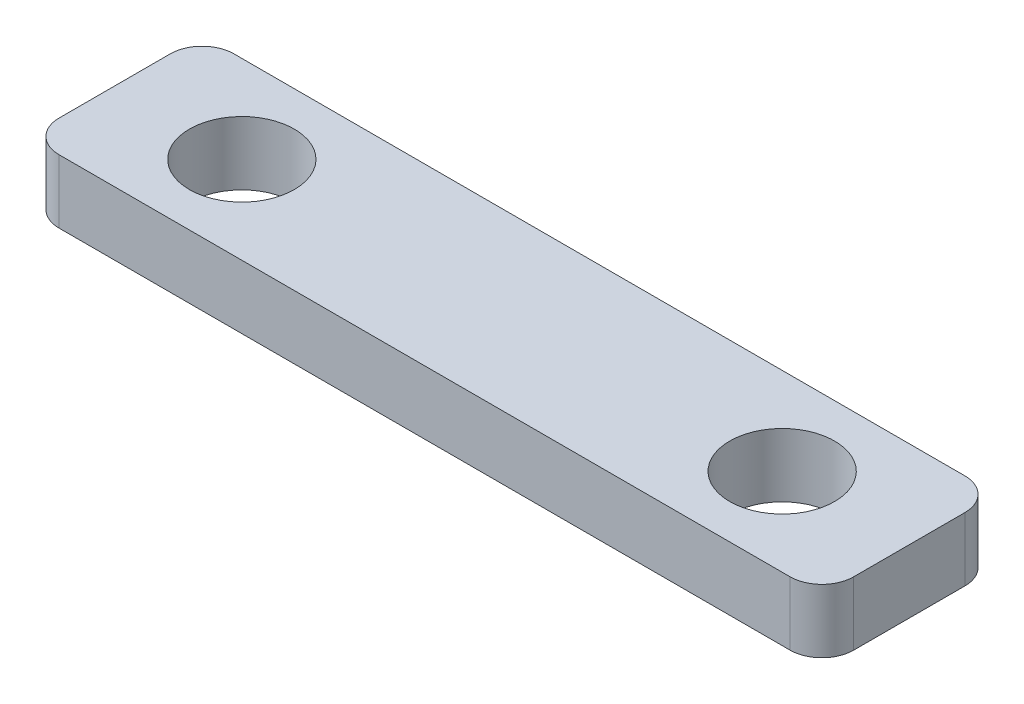
ISO-10303-21;
HEADER;
FILE_DESCRIPTION(('STEP AP214'),'2;1');
FILE_NAME('part.step','',(''),(''),'','','');
FILE_SCHEMA(('AUTOMOTIVE_DESIGN { 1 0 10303 214 1 1 1 1 }'));
ENDSEC;
DATA;
#1=APPLICATION_CONTEXT('core data for automotive mechanical design processes');
#2=APPLICATION_PROTOCOL_DEFINITION('international standard','automotive_design',2000,#1);
#3=PRODUCT_CONTEXT('',#1,'mechanical');
#4=PRODUCT('Part','Part','',(#3));
#5=PRODUCT_RELATED_PRODUCT_CATEGORY('part','',(#4));
#6=PRODUCT_DEFINITION_FORMATION('','',#4);
#7=PRODUCT_DEFINITION_CONTEXT('part definition',#1,'design');
#8=PRODUCT_DEFINITION('design','',#6,#7);
#9=PRODUCT_DEFINITION_SHAPE('','',#8);
#10=(LENGTH_UNIT() NAMED_UNIT(*) SI_UNIT(.MILLI.,.METRE.));
#11=(NAMED_UNIT(*) PLANE_ANGLE_UNIT() SI_UNIT($,.RADIAN.));
#12=(NAMED_UNIT(*) SI_UNIT($,.STERADIAN.) SOLID_ANGLE_UNIT());
#13=UNCERTAINTY_MEASURE_WITH_UNIT(LENGTH_MEASURE(1.E-05),#10,'distance_accuracy_value','');
#14=(GEOMETRIC_REPRESENTATION_CONTEXT(3) GLOBAL_UNCERTAINTY_ASSIGNED_CONTEXT((#13)) GLOBAL_UNIT_ASSIGNED_CONTEXT((#10,
#11,#12)) REPRESENTATION_CONTEXT('',''));
#15=CARTESIAN_POINT('',(0.,0.,0.));
#16=DIRECTION('',(0.,0.,1.));
#17=DIRECTION('',(1.,0.,0.));
#18=AXIS2_PLACEMENT_3D('',#15,#16,#17);
#19=CARTESIAN_POINT('',(0.,2.,0.));
#20=DIRECTION('',(0.,-1.,0.));
#21=DIRECTION('',(0.,0.,-1.));
#22=AXIS2_PLACEMENT_3D('',#19,#20,#21);
#23=PLANE('',#22);
#24=DIRECTION('',(-1.,0.,0.));
#25=VECTOR('',#24,1.);
#26=CARTESIAN_POINT('',(0.,2.,-5.5));
#27=LINE('',#26,#25);
#28=CARTESIAN_POINT('',(24.,2.,-5.5));
#29=VERTEX_POINT('',#28);
#30=CARTESIAN_POINT('',(0.999999999999999,2.,-5.5));
#31=VERTEX_POINT('',#30);
#32=EDGE_CURVE('E149',#29,#31,#27,.T.);
#33=ORIENTED_EDGE('',*,*,#32,.T.);
#34=CARTESIAN_POINT('',(0.999999999999999,2.,-4.5));
#35=DIRECTION('',(0.,-1.,0.));
#36=DIRECTION('',(0.,0.,-1.));
#37=AXIS2_PLACEMENT_3D('',#34,#35,#36);
#38=CIRCLE('',#37,1.);
#39=CARTESIAN_POINT('',(0.,2.,-4.5));
#40=VERTEX_POINT('',#39);
#41=EDGE_CURVE('E177',#31,#40,#38,.F.);
#42=ORIENTED_EDGE('',*,*,#41,.T.);
#43=DIRECTION('',(0.,0.,1.));
#44=VECTOR('',#43,1.);
#45=CARTESIAN_POINT('',(0.,2.,0.));
#46=LINE('',#45,#44);
#47=CARTESIAN_POINT('',(0.,2.,-1.));
#48=VERTEX_POINT('',#47);
#49=EDGE_CURVE('E126',#40,#48,#46,.T.);
#50=ORIENTED_EDGE('',*,*,#49,.T.);
#51=CARTESIAN_POINT('',(1.,2.,-1.));
#52=DIRECTION('',(0.,-1.,0.));
#53=DIRECTION('',(0.,0.,-1.));
#54=AXIS2_PLACEMENT_3D('',#51,#52,#53);
#55=CIRCLE('',#54,1.);
#56=CARTESIAN_POINT('',(1.,2.,0.));
#57=VERTEX_POINT('',#56);
#58=EDGE_CURVE('E169',#48,#57,#55,.F.);
#59=ORIENTED_EDGE('',*,*,#58,.T.);
#60=DIRECTION('',(1.,0.,0.));
#61=VECTOR('',#60,1.);
#62=CARTESIAN_POINT('',(0.,2.,0.));
#63=LINE('',#62,#61);
#64=CARTESIAN_POINT('',(24.,2.,0.));
#65=VERTEX_POINT('',#64);
#66=EDGE_CURVE('E192',#57,#65,#63,.T.);
#67=ORIENTED_EDGE('',*,*,#66,.T.);
#68=CARTESIAN_POINT('',(24.,2.,-1.));
#69=DIRECTION('',(0.,-1.,0.));
#70=DIRECTION('',(0.,0.,-1.));
#71=AXIS2_PLACEMENT_3D('',#68,#69,#70);
#72=CIRCLE('',#71,1.);
#73=CARTESIAN_POINT('',(25.,2.,-1.));
#74=VERTEX_POINT('',#73);
#75=EDGE_CURVE('E61',#65,#74,#72,.F.);
#76=ORIENTED_EDGE('',*,*,#75,.T.);
#77=DIRECTION('',(0.,0.,-1.));
#78=VECTOR('',#77,1.);
#79=CARTESIAN_POINT('',(25.,2.,0.));
#80=LINE('',#79,#78);
#81=CARTESIAN_POINT('',(25.,2.,-4.5));
#82=VERTEX_POINT('',#81);
#83=EDGE_CURVE('E200',#74,#82,#80,.T.);
#84=ORIENTED_EDGE('',*,*,#83,.T.);
#85=CARTESIAN_POINT('',(24.,2.,-4.5));
#86=DIRECTION('',(0.,-1.,0.));
#87=DIRECTION('',(0.,0.,-1.));
#88=AXIS2_PLACEMENT_3D('',#85,#86,#87);
#89=CIRCLE('',#88,1.);
#90=EDGE_CURVE('E174',#82,#29,#89,.F.);
#91=ORIENTED_EDGE('',*,*,#90,.T.);
#92=EDGE_LOOP('',(#33,#42,#50,#59,#67,#76,#84,#91));
#93=FACE_BOUND('',#92,.T.);
#94=CARTESIAN_POINT('',(4.,2.,-2.75));
#95=DIRECTION('',(0.,1.,0.));
#96=DIRECTION('',(0.,0.,1.));
#97=AXIS2_PLACEMENT_3D('',#94,#95,#96);
#98=CIRCLE('',#97,1.65);
#99=CARTESIAN_POINT('',(4.,2.,-1.1));
#100=VERTEX_POINT('',#99);
#101=EDGE_CURVE('E136',#100,#100,#98,.T.);
#102=ORIENTED_EDGE('',*,*,#101,.F.);
#103=EDGE_LOOP('',(#102));
#104=FACE_BOUND('',#103,.T.);
#105=CARTESIAN_POINT('',(21.,2.,-2.75));
#106=DIRECTION('',(0.,1.,0.));
#107=DIRECTION('',(0.,0.,1.));
#108=AXIS2_PLACEMENT_3D('',#105,#106,#107);
#109=CIRCLE('',#108,1.65);
#110=CARTESIAN_POINT('',(21.,2.,-1.1));
#111=VERTEX_POINT('',#110);
#112=EDGE_CURVE('E212',#111,#111,#109,.T.);
#113=ORIENTED_EDGE('',*,*,#112,.F.);
#114=EDGE_LOOP('',(#113));
#115=FACE_BOUND('',#114,.T.);
#116=ADVANCED_FACE('F38',(#93,#104,#115),#23,.F.);
#117=CARTESIAN_POINT('',(0.,0.,0.));
#118=DIRECTION('',(0.,-1.,0.));
#119=DIRECTION('',(0.,0.,-1.));
#120=AXIS2_PLACEMENT_3D('',#117,#118,#119);
#121=PLANE('',#120);
#122=CARTESIAN_POINT('',(4.,0.,-2.75));
#123=DIRECTION('',(0.,1.,0.));
#124=DIRECTION('',(0.,0.,1.));
#125=AXIS2_PLACEMENT_3D('',#122,#123,#124);
#126=CIRCLE('',#125,1.65);
#127=CARTESIAN_POINT('',(4.,0.,-1.1));
#128=VERTEX_POINT('',#127);
#129=EDGE_CURVE('E146',#128,#128,#126,.T.);
#130=ORIENTED_EDGE('',*,*,#129,.T.);
#131=EDGE_LOOP('',(#130));
#132=FACE_BOUND('',#131,.T.);
#133=DIRECTION('',(0.,0.,1.));
#134=VECTOR('',#133,1.);
#135=CARTESIAN_POINT('',(0.,0.,0.));
#136=LINE('',#135,#134);
#137=CARTESIAN_POINT('',(0.,0.,-4.5));
#138=VERTEX_POINT('',#137);
#139=CARTESIAN_POINT('',(0.,0.,-1.));
#140=VERTEX_POINT('',#139);
#141=EDGE_CURVE('E123',#138,#140,#136,.T.);
#142=ORIENTED_EDGE('',*,*,#141,.F.);
#143=CARTESIAN_POINT('',(0.999999999999999,0.,-4.5));
#144=DIRECTION('',(0.,-1.,0.));
#145=DIRECTION('',(0.,0.,-1.));
#146=AXIS2_PLACEMENT_3D('',#143,#144,#145);
#147=CIRCLE('',#146,1.);
#148=CARTESIAN_POINT('',(0.999999999999999,0.,-5.5));
#149=VERTEX_POINT('',#148);
#150=EDGE_CURVE('E105',#138,#149,#147,.T.);
#151=ORIENTED_EDGE('',*,*,#150,.T.);
#152=DIRECTION('',(-1.,0.,0.));
#153=VECTOR('',#152,1.);
#154=CARTESIAN_POINT('',(0.,0.,-5.5));
#155=LINE('',#154,#153);
#156=CARTESIAN_POINT('',(24.,0.,-5.5));
#157=VERTEX_POINT('',#156);
#158=EDGE_CURVE('E153',#157,#149,#155,.T.);
#159=ORIENTED_EDGE('',*,*,#158,.F.);
#160=CARTESIAN_POINT('',(24.,0.,-4.5));
#161=DIRECTION('',(0.,-1.,0.));
#162=DIRECTION('',(0.,0.,-1.));
#163=AXIS2_PLACEMENT_3D('',#160,#161,#162);
#164=CIRCLE('',#163,1.);
#165=CARTESIAN_POINT('',(25.,0.,-4.5));
#166=VERTEX_POINT('',#165);
#167=EDGE_CURVE('E117',#157,#166,#164,.T.);
#168=ORIENTED_EDGE('',*,*,#167,.T.);
#169=DIRECTION('',(0.,0.,-1.));
#170=VECTOR('',#169,1.);
#171=CARTESIAN_POINT('',(25.,0.,0.));
#172=LINE('',#171,#170);
#173=CARTESIAN_POINT('',(25.,0.,-1.));
#174=VERTEX_POINT('',#173);
#175=EDGE_CURVE('E142',#174,#166,#172,.T.);
#176=ORIENTED_EDGE('',*,*,#175,.F.);
#177=CARTESIAN_POINT('',(24.,0.,-1.));
#178=DIRECTION('',(0.,-1.,0.));
#179=DIRECTION('',(0.,0.,-1.));
#180=AXIS2_PLACEMENT_3D('',#177,#178,#179);
#181=CIRCLE('',#180,1.);
#182=CARTESIAN_POINT('',(24.,0.,0.));
#183=VERTEX_POINT('',#182);
#184=EDGE_CURVE('E159',#174,#183,#181,.T.);
#185=ORIENTED_EDGE('',*,*,#184,.T.);
#186=DIRECTION('',(1.,0.,0.));
#187=VECTOR('',#186,1.);
#188=CARTESIAN_POINT('',(0.,0.,0.));
#189=LINE('',#188,#187);
#190=CARTESIAN_POINT('',(1.,0.,0.));
#191=VERTEX_POINT('',#190);
#192=EDGE_CURVE('E135',#191,#183,#189,.T.);
#193=ORIENTED_EDGE('',*,*,#192,.F.);
#194=CARTESIAN_POINT('',(1.,0.,-1.));
#195=DIRECTION('',(0.,-1.,0.));
#196=DIRECTION('',(0.,0.,-1.));
#197=AXIS2_PLACEMENT_3D('',#194,#195,#196);
#198=CIRCLE('',#197,1.);
#199=EDGE_CURVE('E128',#191,#140,#198,.T.);
#200=ORIENTED_EDGE('',*,*,#199,.T.);
#201=EDGE_LOOP('',(#142,#151,#159,#168,#176,#185,#193,#200));
#202=FACE_BOUND('',#201,.T.);
#203=CARTESIAN_POINT('',(21.,0.,-2.75));
#204=DIRECTION('',(0.,1.,0.));
#205=DIRECTION('',(0.,0.,1.));
#206=AXIS2_PLACEMENT_3D('',#203,#204,#205);
#207=CIRCLE('',#206,1.65);
#208=CARTESIAN_POINT('',(21.,0.,-1.1));
#209=VERTEX_POINT('',#208);
#210=EDGE_CURVE('E214',#209,#209,#207,.T.);
#211=ORIENTED_EDGE('',*,*,#210,.T.);
#212=EDGE_LOOP('',(#211));
#213=FACE_BOUND('',#212,.T.);
#214=ADVANCED_FACE('F131',(#132,#202,#213),#121,.T.);
#215=CARTESIAN_POINT('',(0.,2.,0.));
#216=DIRECTION('',(1.,0.,0.));
#217=DIRECTION('',(0.,0.,-1.));
#218=AXIS2_PLACEMENT_3D('',#215,#216,#217);
#219=PLANE('',#218);
#220=ORIENTED_EDGE('',*,*,#49,.F.);
#221=DIRECTION('',(0.,-1.,0.));
#222=VECTOR('',#221,1.);
#223=CARTESIAN_POINT('',(0.,2.,-4.5));
#224=LINE('',#223,#222);
#225=EDGE_CURVE('E109',#40,#138,#224,.T.);
#226=ORIENTED_EDGE('',*,*,#225,.T.);
#227=ORIENTED_EDGE('',*,*,#141,.T.);
#228=DIRECTION('',(0.,-1.,0.));
#229=VECTOR('',#228,1.);
#230=CARTESIAN_POINT('',(0.,2.,-1.));
#231=LINE('',#230,#229);
#232=EDGE_CURVE('E129',#140,#48,#231,.F.);
#233=ORIENTED_EDGE('',*,*,#232,.T.);
#234=EDGE_LOOP('',(#220,#226,#227,#233));
#235=FACE_BOUND('',#234,.T.);
#236=ADVANCED_FACE('F122',(#235),#219,.F.);
#237=CARTESIAN_POINT('',(0.,2.,0.));
#238=DIRECTION('',(0.,0.,-1.));
#239=DIRECTION('',(-1.,0.,0.));
#240=AXIS2_PLACEMENT_3D('',#237,#238,#239);
#241=PLANE('',#240);
#242=ORIENTED_EDGE('',*,*,#192,.T.);
#243=DIRECTION('',(0.,-1.,0.));
#244=VECTOR('',#243,1.);
#245=CARTESIAN_POINT('',(24.,2.,0.));
#246=LINE('',#245,#244);
#247=EDGE_CURVE('E11',#183,#65,#246,.F.);
#248=ORIENTED_EDGE('',*,*,#247,.T.);
#249=ORIENTED_EDGE('',*,*,#66,.F.);
#250=DIRECTION('',(0.,-1.,0.));
#251=VECTOR('',#250,1.);
#252=CARTESIAN_POINT('',(1.,2.,0.));
#253=LINE('',#252,#251);
#254=EDGE_CURVE('E47',#57,#191,#253,.T.);
#255=ORIENTED_EDGE('',*,*,#254,.T.);
#256=EDGE_LOOP('',(#242,#248,#249,#255));
#257=FACE_BOUND('',#256,.T.);
#258=ADVANCED_FACE('F190',(#257),#241,.F.);
#259=CARTESIAN_POINT('',(25.,2.,0.));
#260=DIRECTION('',(-1.,0.,0.));
#261=DIRECTION('',(0.,0.,1.));
#262=AXIS2_PLACEMENT_3D('',#259,#260,#261);
#263=PLANE('',#262);
#264=ORIENTED_EDGE('',*,*,#175,.T.);
#265=DIRECTION('',(0.,-1.,0.));
#266=VECTOR('',#265,1.);
#267=CARTESIAN_POINT('',(25.,2.,-4.5));
#268=LINE('',#267,#266);
#269=EDGE_CURVE('E54',#166,#82,#268,.F.);
#270=ORIENTED_EDGE('',*,*,#269,.T.);
#271=ORIENTED_EDGE('',*,*,#83,.F.);
#272=DIRECTION('',(0.,-1.,0.));
#273=VECTOR('',#272,1.);
#274=CARTESIAN_POINT('',(25.,2.,-1.));
#275=LINE('',#274,#273);
#276=EDGE_CURVE('E180',#74,#174,#275,.T.);
#277=ORIENTED_EDGE('',*,*,#276,.T.);
#278=EDGE_LOOP('',(#264,#270,#271,#277));
#279=FACE_BOUND('',#278,.T.);
#280=ADVANCED_FACE('F199',(#279),#263,.F.);
#281=CARTESIAN_POINT('',(0.,2.,-5.5));
#282=DIRECTION('',(0.,0.,1.));
#283=DIRECTION('',(1.,0.,0.));
#284=AXIS2_PLACEMENT_3D('',#281,#282,#283);
#285=PLANE('',#284);
#286=ORIENTED_EDGE('',*,*,#158,.T.);
#287=DIRECTION('',(0.,-1.,0.));
#288=VECTOR('',#287,1.);
#289=CARTESIAN_POINT('',(0.999999999999999,2.,-5.5));
#290=LINE('',#289,#288);
#291=EDGE_CURVE('E110',#149,#31,#290,.F.);
#292=ORIENTED_EDGE('',*,*,#291,.T.);
#293=ORIENTED_EDGE('',*,*,#32,.F.);
#294=DIRECTION('',(0.,-1.,0.));
#295=VECTOR('',#294,1.);
#296=CARTESIAN_POINT('',(24.,2.,-5.5));
#297=LINE('',#296,#295);
#298=EDGE_CURVE('E116',#29,#157,#297,.T.);
#299=ORIENTED_EDGE('',*,*,#298,.T.);
#300=EDGE_LOOP('',(#286,#292,#293,#299));
#301=FACE_BOUND('',#300,.T.);
#302=ADVANCED_FACE('F237',(#301),#285,.F.);
#303=CARTESIAN_POINT('',(4.,2.,-2.75));
#304=DIRECTION('',(0.,-1.,0.));
#305=DIRECTION('',(0.,0.,-1.));
#306=AXIS2_PLACEMENT_3D('',#303,#304,#305);
#307=CYLINDRICAL_SURFACE('',#306,1.65);
#308=ORIENTED_EDGE('',*,*,#101,.T.);
#309=EDGE_LOOP('',(#308));
#310=FACE_BOUND('',#309,.T.);
#311=ORIENTED_EDGE('',*,*,#129,.F.);
#312=EDGE_LOOP('',(#311));
#313=FACE_BOUND('',#312,.T.);
#314=ADVANCED_FACE('F234',(#310,#313),#307,.F.);
#315=CARTESIAN_POINT('',(21.,2.,-2.75));
#316=DIRECTION('',(0.,-1.,0.));
#317=DIRECTION('',(0.,0.,-1.));
#318=AXIS2_PLACEMENT_3D('',#315,#316,#317);
#319=CYLINDRICAL_SURFACE('',#318,1.65);
#320=ORIENTED_EDGE('',*,*,#112,.T.);
#321=EDGE_LOOP('',(#320));
#322=FACE_BOUND('',#321,.T.);
#323=ORIENTED_EDGE('',*,*,#210,.F.);
#324=EDGE_LOOP('',(#323));
#325=FACE_BOUND('',#324,.T.);
#326=ADVANCED_FACE('F222',(#322,#325),#319,.F.);
#327=CARTESIAN_POINT('',(0.999999999999999,2.,-4.5));
#328=DIRECTION('',(0.,-1.,0.));
#329=DIRECTION('',(0.,0.,-1.));
#330=AXIS2_PLACEMENT_3D('',#327,#328,#329);
#331=CYLINDRICAL_SURFACE('',#330,1.);
#332=ORIENTED_EDGE('',*,*,#41,.F.);
#333=ORIENTED_EDGE('',*,*,#291,.F.);
#334=ORIENTED_EDGE('',*,*,#150,.F.);
#335=ORIENTED_EDGE('',*,*,#225,.F.);
#336=EDGE_LOOP('',(#332,#333,#334,#335));
#337=FACE_BOUND('',#336,.T.);
#338=ADVANCED_FACE('F108',(#337),#331,.T.);
#339=CARTESIAN_POINT('',(24.,2.,-4.5));
#340=DIRECTION('',(0.,-1.,0.));
#341=DIRECTION('',(0.,0.,-1.));
#342=AXIS2_PLACEMENT_3D('',#339,#340,#341);
#343=CYLINDRICAL_SURFACE('',#342,1.);
#344=ORIENTED_EDGE('',*,*,#90,.F.);
#345=ORIENTED_EDGE('',*,*,#269,.F.);
#346=ORIENTED_EDGE('',*,*,#167,.F.);
#347=ORIENTED_EDGE('',*,*,#298,.F.);
#348=EDGE_LOOP('',(#344,#345,#346,#347));
#349=FACE_BOUND('',#348,.T.);
#350=ADVANCED_FACE('F249',(#349),#343,.T.);
#351=CARTESIAN_POINT('',(24.,2.,-1.));
#352=DIRECTION('',(0.,-1.,0.));
#353=DIRECTION('',(0.,0.,-1.));
#354=AXIS2_PLACEMENT_3D('',#351,#352,#353);
#355=CYLINDRICAL_SURFACE('',#354,1.);
#356=ORIENTED_EDGE('',*,*,#75,.F.);
#357=ORIENTED_EDGE('',*,*,#247,.F.);
#358=ORIENTED_EDGE('',*,*,#184,.F.);
#359=ORIENTED_EDGE('',*,*,#276,.F.);
#360=EDGE_LOOP('',(#356,#357,#358,#359));
#361=FACE_BOUND('',#360,.T.);
#362=ADVANCED_FACE('F198',(#361),#355,.T.);
#363=CARTESIAN_POINT('',(1.,2.,-1.));
#364=DIRECTION('',(0.,-1.,0.));
#365=DIRECTION('',(0.,0.,-1.));
#366=AXIS2_PLACEMENT_3D('',#363,#364,#365);
#367=CYLINDRICAL_SURFACE('',#366,1.);
#368=ORIENTED_EDGE('',*,*,#58,.F.);
#369=ORIENTED_EDGE('',*,*,#232,.F.);
#370=ORIENTED_EDGE('',*,*,#199,.F.);
#371=ORIENTED_EDGE('',*,*,#254,.F.);
#372=EDGE_LOOP('',(#368,#369,#370,#371));
#373=FACE_BOUND('',#372,.T.);
#374=ADVANCED_FACE('F40',(#373),#367,.T.);
#375=CLOSED_SHELL('',(#116,#214,#236,#258,#280,#302,#314,#326,#338,#350,#362,#374));
#376=MANIFOLD_SOLID_BREP('B2',#375);
#377=ADVANCED_BREP_SHAPE_REPRESENTATION('',(#18,#376),#14);
#378=SHAPE_DEFINITION_REPRESENTATION(#9,#377);
ENDSEC;
END-ISO-10303-21;
